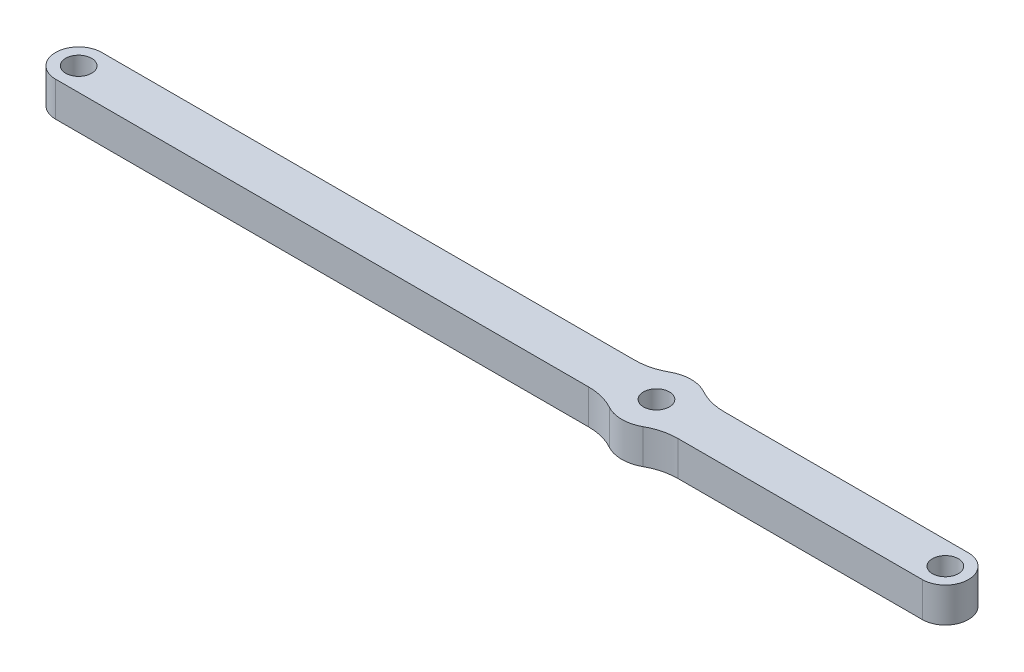
ISO-10303-21;
HEADER;
FILE_DESCRIPTION(('STEP AP214'),'2;1');
FILE_NAME('part.step','',(''),(''),'','','');
FILE_SCHEMA(('AUTOMOTIVE_DESIGN { 1 0 10303 214 1 1 1 1 }'));
ENDSEC;
DATA;
#1=APPLICATION_CONTEXT('core data for automotive mechanical design processes');
#2=APPLICATION_PROTOCOL_DEFINITION('international standard','automotive_design',2000,#1);
#3=PRODUCT_CONTEXT('',#1,'mechanical');
#4=PRODUCT('Part','Part','',(#3));
#5=PRODUCT_RELATED_PRODUCT_CATEGORY('part','',(#4));
#6=PRODUCT_DEFINITION_FORMATION('','',#4);
#7=PRODUCT_DEFINITION_CONTEXT('part definition',#1,'design');
#8=PRODUCT_DEFINITION('design','',#6,#7);
#9=PRODUCT_DEFINITION_SHAPE('','',#8);
#10=(LENGTH_UNIT() NAMED_UNIT(*) SI_UNIT(.MILLI.,.METRE.));
#11=(NAMED_UNIT(*) PLANE_ANGLE_UNIT() SI_UNIT($,.RADIAN.));
#12=(NAMED_UNIT(*) SI_UNIT($,.STERADIAN.) SOLID_ANGLE_UNIT());
#13=UNCERTAINTY_MEASURE_WITH_UNIT(LENGTH_MEASURE(1.E-05),#10,'distance_accuracy_value','');
#14=(GEOMETRIC_REPRESENTATION_CONTEXT(3) GLOBAL_UNCERTAINTY_ASSIGNED_CONTEXT((#13)) GLOBAL_UNIT_ASSIGNED_CONTEXT((#10,
#11,#12)) REPRESENTATION_CONTEXT('',''));
#15=CARTESIAN_POINT('',(0.,0.,0.));
#16=DIRECTION('',(0.,0.,1.));
#17=DIRECTION('',(1.,0.,0.));
#18=AXIS2_PLACEMENT_3D('',#15,#16,#17);
#19=CARTESIAN_POINT('',(0.,6.,0.));
#20=DIRECTION('',(0.,1.,0.));
#21=DIRECTION('',(0.,0.,1.));
#22=AXIS2_PLACEMENT_3D('',#19,#20,#21);
#23=PLANE('',#22);
#24=CARTESIAN_POINT('',(50.,6.,0.));
#25=DIRECTION('',(0.,1.,0.));
#26=DIRECTION('',(0.,0.,1.));
#27=AXIS2_PLACEMENT_3D('',#24,#25,#26);
#28=CIRCLE('',#27,2.25);
#29=CARTESIAN_POINT('',(50.,6.,2.25));
#30=VERTEX_POINT('',#29);
#31=EDGE_CURVE('E404',#30,#30,#28,.T.);
#32=ORIENTED_EDGE('',*,*,#31,.F.);
#33=EDGE_LOOP('',(#32));
#34=FACE_BOUND('',#33,.T.);
#35=DIRECTION('',(-1.,0.,0.));
#36=VECTOR('',#35,1.);
#37=CARTESIAN_POINT('',(4.47213595500337,6.,-3.99999999999576));
#38=LINE('',#37,#36);
#39=CARTESIAN_POINT('',(50.,6.,-4.00000000000001));
#40=VERTEX_POINT('',#39);
#41=CARTESIAN_POINT('',(7.74596669242288,6.,-3.99999999999606));
#42=VERTEX_POINT('',#41);
#43=EDGE_CURVE('E160',#40,#42,#38,.T.);
#44=ORIENTED_EDGE('',*,*,#43,.T.);
#45=CARTESIAN_POINT('',(7.74596669242194,6.,-13.9999999999961));
#46=DIRECTION('',(0.,1.,0.));
#47=DIRECTION('',(0.,0.,1.));
#48=AXIS2_PLACEMENT_3D('',#45,#46,#47);
#49=CIRCLE('',#48,10.);
#50=CARTESIAN_POINT('',(2.90473750965823,6.,-5.24999999999853));
#51=VERTEX_POINT('',#50);
#52=EDGE_CURVE('E207',#42,#51,#49,.F.);
#53=ORIENTED_EDGE('',*,*,#52,.T.);
#54=CARTESIAN_POINT('',(0.,6.,0.));
#55=DIRECTION('',(0.,1.,0.));
#56=DIRECTION('',(0.,0.,1.));
#57=AXIS2_PLACEMENT_3D('',#54,#55,#56);
#58=CIRCLE('',#57,6.);
#59=CARTESIAN_POINT('',(-2.90473750965556,6.,-5.25));
#60=VERTEX_POINT('',#59);
#61=EDGE_CURVE('E134',#51,#60,#58,.T.);
#62=ORIENTED_EDGE('',*,*,#61,.T.);
#63=CARTESIAN_POINT('',(-7.74596669241482,6.,-14.));
#64=DIRECTION('',(0.,1.,0.));
#65=DIRECTION('',(0.,0.,1.));
#66=AXIS2_PLACEMENT_3D('',#63,#64,#65);
#67=CIRCLE('',#66,10.);
#68=CARTESIAN_POINT('',(-7.74596669241483,6.,-4.00000000000001));
#69=VERTEX_POINT('',#68);
#70=EDGE_CURVE('E130',#60,#69,#67,.F.);
#71=ORIENTED_EDGE('',*,*,#70,.T.);
#72=DIRECTION('',(-1.,0.,0.));
#73=VECTOR('',#72,1.);
#74=CARTESIAN_POINT('',(-100.,6.,-4.00000000000001));
#75=LINE('',#74,#73);
#76=CARTESIAN_POINT('',(-100.,6.,-4.00000000000001));
#77=VERTEX_POINT('',#76);
#78=EDGE_CURVE('E121',#69,#77,#75,.T.);
#79=ORIENTED_EDGE('',*,*,#78,.T.);
#80=CARTESIAN_POINT('',(-100.,6.,0.));
#81=DIRECTION('',(0.,1.,0.));
#82=DIRECTION('',(0.,0.,1.));
#83=AXIS2_PLACEMENT_3D('',#80,#81,#82);
#84=CIRCLE('',#83,4.00000000000001);
#85=CARTESIAN_POINT('',(-100.,6.,4.00000000000001));
#86=VERTEX_POINT('',#85);
#87=EDGE_CURVE('E126',#77,#86,#84,.T.);
#88=ORIENTED_EDGE('',*,*,#87,.T.);
#89=DIRECTION('',(1.,0.,0.));
#90=VECTOR('',#89,1.);
#91=CARTESIAN_POINT('',(-4.47213595500356,6.,3.99999999999555));
#92=LINE('',#91,#90);
#93=CARTESIAN_POINT('',(-7.74596669242306,6.,3.9999999999957));
#94=VERTEX_POINT('',#93);
#95=EDGE_CURVE('E148',#86,#94,#92,.T.);
#96=ORIENTED_EDGE('',*,*,#95,.T.);
#97=CARTESIAN_POINT('',(-7.7459666924226,6.,13.9999999999957));
#98=DIRECTION('',(0.,1.,0.));
#99=DIRECTION('',(0.,0.,1.));
#100=AXIS2_PLACEMENT_3D('',#97,#98,#99);
#101=CIRCLE('',#100,10.);
#102=CARTESIAN_POINT('',(-2.90473750965847,6.,5.24999999999839));
#103=VERTEX_POINT('',#102);
#104=EDGE_CURVE('E11',#94,#103,#101,.F.);
#105=ORIENTED_EDGE('',*,*,#104,.T.);
#106=CARTESIAN_POINT('',(0.,6.,0.));
#107=DIRECTION('',(0.,1.,0.));
#108=DIRECTION('',(0.,0.,1.));
#109=AXIS2_PLACEMENT_3D('',#106,#107,#108);
#110=CIRCLE('',#109,6.);
#111=CARTESIAN_POINT('',(2.90473750965556,6.,5.25));
#112=VERTEX_POINT('',#111);
#113=EDGE_CURVE('E150',#103,#112,#110,.T.);
#114=ORIENTED_EDGE('',*,*,#113,.T.);
#115=CARTESIAN_POINT('',(7.74596669241482,6.,14.));
#116=DIRECTION('',(0.,1.,0.));
#117=DIRECTION('',(0.,0.,1.));
#118=AXIS2_PLACEMENT_3D('',#115,#116,#117);
#119=CIRCLE('',#118,10.);
#120=CARTESIAN_POINT('',(7.74596669241483,6.,4.00000000000001));
#121=VERTEX_POINT('',#120);
#122=EDGE_CURVE('E214',#112,#121,#119,.F.);
#123=ORIENTED_EDGE('',*,*,#122,.T.);
#124=DIRECTION('',(1.,0.,0.));
#125=VECTOR('',#124,1.);
#126=CARTESIAN_POINT('',(50.,6.,4.00000000000001));
#127=LINE('',#126,#125);
#128=CARTESIAN_POINT('',(50.,6.,4.00000000000001));
#129=VERTEX_POINT('',#128);
#130=EDGE_CURVE('E156',#121,#129,#127,.T.);
#131=ORIENTED_EDGE('',*,*,#130,.T.);
#132=CARTESIAN_POINT('',(50.,6.,0.));
#133=DIRECTION('',(0.,1.,0.));
#134=DIRECTION('',(0.,0.,1.));
#135=AXIS2_PLACEMENT_3D('',#132,#133,#134);
#136=CIRCLE('',#135,4.00000000000001);
#137=EDGE_CURVE('E158',#129,#40,#136,.T.);
#138=ORIENTED_EDGE('',*,*,#137,.T.);
#139=EDGE_LOOP('',(#44,#53,#62,#71,#79,#88,#96,#105,#114,#123,#131,#138));
#140=FACE_BOUND('',#139,.T.);
#141=CARTESIAN_POINT('',(0.,6.,0.));
#142=DIRECTION('',(0.,1.,0.));
#143=DIRECTION('',(0.,0.,1.));
#144=AXIS2_PLACEMENT_3D('',#141,#142,#143);
#145=CIRCLE('',#144,2.25);
#146=CARTESIAN_POINT('',(0.,6.,2.25));
#147=VERTEX_POINT('',#146);
#148=EDGE_CURVE('E166',#147,#147,#145,.T.);
#149=ORIENTED_EDGE('',*,*,#148,.F.);
#150=EDGE_LOOP('',(#149));
#151=FACE_BOUND('',#150,.T.);
#152=CARTESIAN_POINT('',(-100.,6.,0.));
#153=DIRECTION('',(0.,1.,0.));
#154=DIRECTION('',(0.,0.,1.));
#155=AXIS2_PLACEMENT_3D('',#152,#153,#154);
#156=CIRCLE('',#155,2.25);
#157=CARTESIAN_POINT('',(-100.,6.,2.25));
#158=VERTEX_POINT('',#157);
#159=EDGE_CURVE('E395',#158,#158,#156,.T.);
#160=ORIENTED_EDGE('',*,*,#159,.F.);
#161=EDGE_LOOP('',(#160));
#162=FACE_BOUND('',#161,.T.);
#163=ADVANCED_FACE('F33',(#34,#140,#151,#162),#23,.T.);
#164=CARTESIAN_POINT('',(0.,0.,0.));
#165=DIRECTION('',(0.,1.,0.));
#166=DIRECTION('',(0.,0.,1.));
#167=AXIS2_PLACEMENT_3D('',#164,#165,#166);
#168=PLANE('',#167);
#169=CARTESIAN_POINT('',(0.,0.,0.));
#170=DIRECTION('',(0.,1.,0.));
#171=DIRECTION('',(0.,0.,1.));
#172=AXIS2_PLACEMENT_3D('',#169,#170,#171);
#173=CIRCLE('',#172,6.);
#174=CARTESIAN_POINT('',(2.90473750965823,0.,-5.24999999999853));
#175=VERTEX_POINT('',#174);
#176=CARTESIAN_POINT('',(-2.90473750965556,0.,-5.25));
#177=VERTEX_POINT('',#176);
#178=EDGE_CURVE('E163',#175,#177,#173,.T.);
#179=ORIENTED_EDGE('',*,*,#178,.F.);
#180=CARTESIAN_POINT('',(7.74596669242194,0.,-13.9999999999961));
#181=DIRECTION('',(0.,1.,0.));
#182=DIRECTION('',(0.,0.,1.));
#183=AXIS2_PLACEMENT_3D('',#180,#181,#182);
#184=CIRCLE('',#183,10.);
#185=CARTESIAN_POINT('',(7.74596669242288,0.,-3.99999999999606));
#186=VERTEX_POINT('',#185);
#187=EDGE_CURVE('E205',#175,#186,#184,.T.);
#188=ORIENTED_EDGE('',*,*,#187,.T.);
#189=DIRECTION('',(-1.,0.,0.));
#190=VECTOR('',#189,1.);
#191=CARTESIAN_POINT('',(4.47213595500337,0.,-3.99999999999576));
#192=LINE('',#191,#190);
#193=CARTESIAN_POINT('',(50.,0.,-4.00000000000001));
#194=VERTEX_POINT('',#193);
#195=EDGE_CURVE('E179',#194,#186,#192,.T.);
#196=ORIENTED_EDGE('',*,*,#195,.F.);
#197=CARTESIAN_POINT('',(50.,0.,0.));
#198=DIRECTION('',(0.,1.,0.));
#199=DIRECTION('',(0.,0.,1.));
#200=AXIS2_PLACEMENT_3D('',#197,#198,#199);
#201=CIRCLE('',#200,4.00000000000001);
#202=CARTESIAN_POINT('',(50.,0.,4.00000000000001));
#203=VERTEX_POINT('',#202);
#204=EDGE_CURVE('E177',#203,#194,#201,.T.);
#205=ORIENTED_EDGE('',*,*,#204,.F.);
#206=DIRECTION('',(1.,0.,0.));
#207=VECTOR('',#206,1.);
#208=CARTESIAN_POINT('',(50.,0.,4.00000000000001));
#209=LINE('',#208,#207);
#210=CARTESIAN_POINT('',(7.74596669241483,0.,4.00000000000001));
#211=VERTEX_POINT('',#210);
#212=EDGE_CURVE('E175',#211,#203,#209,.T.);
#213=ORIENTED_EDGE('',*,*,#212,.F.);
#214=CARTESIAN_POINT('',(7.74596669241482,0.,14.));
#215=DIRECTION('',(0.,1.,0.));
#216=DIRECTION('',(0.,0.,1.));
#217=AXIS2_PLACEMENT_3D('',#214,#215,#216);
#218=CIRCLE('',#217,10.);
#219=CARTESIAN_POINT('',(2.90473750965556,0.,5.25));
#220=VERTEX_POINT('',#219);
#221=EDGE_CURVE('E212',#211,#220,#218,.T.);
#222=ORIENTED_EDGE('',*,*,#221,.T.);
#223=CARTESIAN_POINT('',(0.,0.,0.));
#224=DIRECTION('',(0.,1.,0.));
#225=DIRECTION('',(0.,0.,1.));
#226=AXIS2_PLACEMENT_3D('',#223,#224,#225);
#227=CIRCLE('',#226,6.);
#228=CARTESIAN_POINT('',(-2.90473750965847,0.,5.24999999999839));
#229=VERTEX_POINT('',#228);
#230=EDGE_CURVE('E172',#229,#220,#227,.T.);
#231=ORIENTED_EDGE('',*,*,#230,.F.);
#232=CARTESIAN_POINT('',(-7.7459666924226,0.,13.9999999999957));
#233=DIRECTION('',(0.,1.,0.));
#234=DIRECTION('',(0.,0.,1.));
#235=AXIS2_PLACEMENT_3D('',#232,#233,#234);
#236=CIRCLE('',#235,10.);
#237=CARTESIAN_POINT('',(-7.74596669242306,0.,3.9999999999957));
#238=VERTEX_POINT('',#237);
#239=EDGE_CURVE('E41',#229,#238,#236,.T.);
#240=ORIENTED_EDGE('',*,*,#239,.T.);
#241=DIRECTION('',(1.,0.,0.));
#242=VECTOR('',#241,1.);
#243=CARTESIAN_POINT('',(-4.47213595500356,0.,3.99999999999555));
#244=LINE('',#243,#242);
#245=CARTESIAN_POINT('',(-100.,0.,4.00000000000001));
#246=VERTEX_POINT('',#245);
#247=EDGE_CURVE('E170',#246,#238,#244,.T.);
#248=ORIENTED_EDGE('',*,*,#247,.F.);
#249=CARTESIAN_POINT('',(-100.,0.,0.));
#250=DIRECTION('',(0.,1.,0.));
#251=DIRECTION('',(0.,0.,1.));
#252=AXIS2_PLACEMENT_3D('',#249,#250,#251);
#253=CIRCLE('',#252,4.00000000000001);
#254=CARTESIAN_POINT('',(-100.,0.,-4.00000000000001));
#255=VERTEX_POINT('',#254);
#256=EDGE_CURVE('E168',#255,#246,#253,.T.);
#257=ORIENTED_EDGE('',*,*,#256,.F.);
#258=DIRECTION('',(-1.,0.,0.));
#259=VECTOR('',#258,1.);
#260=CARTESIAN_POINT('',(-100.,0.,-4.00000000000001));
#261=LINE('',#260,#259);
#262=CARTESIAN_POINT('',(-7.74596669241483,0.,-4.00000000000001));
#263=VERTEX_POINT('',#262);
#264=EDGE_CURVE('E140',#263,#255,#261,.T.);
#265=ORIENTED_EDGE('',*,*,#264,.F.);
#266=CARTESIAN_POINT('',(-7.74596669241482,0.,-14.));
#267=DIRECTION('',(0.,1.,0.));
#268=DIRECTION('',(0.,0.,1.));
#269=AXIS2_PLACEMENT_3D('',#266,#267,#268);
#270=CIRCLE('',#269,10.);
#271=EDGE_CURVE('E209',#263,#177,#270,.T.);
#272=ORIENTED_EDGE('',*,*,#271,.T.);
#273=EDGE_LOOP('',(#179,#188,#196,#205,#213,#222,#231,#240,#248,#257,#265,#272));
#274=FACE_BOUND('',#273,.T.);
#275=CARTESIAN_POINT('',(0.,0.,0.));
#276=DIRECTION('',(0.,1.,0.));
#277=DIRECTION('',(0.,0.,1.));
#278=AXIS2_PLACEMENT_3D('',#275,#276,#277);
#279=CIRCLE('',#278,2.25);
#280=CARTESIAN_POINT('',(0.,0.,2.25));
#281=VERTEX_POINT('',#280);
#282=EDGE_CURVE('E407',#281,#281,#279,.T.);
#283=ORIENTED_EDGE('',*,*,#282,.T.);
#284=EDGE_LOOP('',(#283));
#285=FACE_BOUND('',#284,.T.);
#286=CARTESIAN_POINT('',(50.,0.,0.));
#287=DIRECTION('',(0.,1.,0.));
#288=DIRECTION('',(0.,0.,1.));
#289=AXIS2_PLACEMENT_3D('',#286,#287,#288);
#290=CIRCLE('',#289,2.25);
#291=CARTESIAN_POINT('',(50.,0.,2.25));
#292=VERTEX_POINT('',#291);
#293=EDGE_CURVE('E401',#292,#292,#290,.T.);
#294=ORIENTED_EDGE('',*,*,#293,.T.);
#295=EDGE_LOOP('',(#294));
#296=FACE_BOUND('',#295,.T.);
#297=CARTESIAN_POINT('',(-100.,0.,0.));
#298=DIRECTION('',(0.,1.,0.));
#299=DIRECTION('',(0.,0.,1.));
#300=AXIS2_PLACEMENT_3D('',#297,#298,#299);
#301=CIRCLE('',#300,2.25);
#302=CARTESIAN_POINT('',(-100.,0.,2.25));
#303=VERTEX_POINT('',#302);
#304=EDGE_CURVE('E398',#303,#303,#301,.T.);
#305=ORIENTED_EDGE('',*,*,#304,.T.);
#306=EDGE_LOOP('',(#305));
#307=FACE_BOUND('',#306,.T.);
#308=ADVANCED_FACE('F228',(#274,#285,#296,#307),#168,.F.);
#309=CARTESIAN_POINT('',(0.,6.,0.));
#310=DIRECTION('',(0.,-1.,0.));
#311=DIRECTION('',(0.,0.,-1.));
#312=AXIS2_PLACEMENT_3D('',#309,#310,#311);
#313=CYLINDRICAL_SURFACE('',#312,6.);
#314=ORIENTED_EDGE('',*,*,#61,.F.);
#315=DIRECTION('',(0.,-1.,0.));
#316=VECTOR('',#315,1.);
#317=CARTESIAN_POINT('',(2.90473750965823,6.,-5.24999999999853));
#318=LINE('',#317,#316);
#319=EDGE_CURVE('E189',#51,#175,#318,.T.);
#320=ORIENTED_EDGE('',*,*,#319,.T.);
#321=ORIENTED_EDGE('',*,*,#178,.T.);
#322=DIRECTION('',(0.,-1.,0.));
#323=VECTOR('',#322,1.);
#324=CARTESIAN_POINT('',(-2.90473750965556,6.,-5.25));
#325=LINE('',#324,#323);
#326=EDGE_CURVE('E143',#177,#60,#325,.F.);
#327=ORIENTED_EDGE('',*,*,#326,.T.);
#328=EDGE_LOOP('',(#314,#320,#321,#327));
#329=FACE_BOUND('',#328,.T.);
#330=ADVANCED_FACE('F241',(#329),#313,.T.);
#331=CARTESIAN_POINT('',(-100.,6.,-4.00000000000001));
#332=DIRECTION('',(0.,0.,1.));
#333=DIRECTION('',(1.,0.,0.));
#334=AXIS2_PLACEMENT_3D('',#331,#332,#333);
#335=PLANE('',#334);
#336=ORIENTED_EDGE('',*,*,#78,.F.);
#337=DIRECTION('',(0.,1.,0.));
#338=VECTOR('',#337,1.);
#339=CARTESIAN_POINT('',(-7.74596669241482,0.,-4.00000000000001));
#340=LINE('',#339,#338);
#341=EDGE_CURVE('E194',#69,#263,#340,.F.);
#342=ORIENTED_EDGE('',*,*,#341,.T.);
#343=ORIENTED_EDGE('',*,*,#264,.T.);
#344=DIRECTION('',(0.,-1.,0.));
#345=VECTOR('',#344,1.);
#346=CARTESIAN_POINT('',(-100.,6.,-4.00000000000001));
#347=LINE('',#346,#345);
#348=EDGE_CURVE('E137',#77,#255,#347,.T.);
#349=ORIENTED_EDGE('',*,*,#348,.F.);
#350=EDGE_LOOP('',(#336,#342,#343,#349));
#351=FACE_BOUND('',#350,.T.);
#352=ADVANCED_FACE('F138',(#351),#335,.F.);
#353=CARTESIAN_POINT('',(-100.,6.,0.));
#354=DIRECTION('',(0.,-1.,0.));
#355=DIRECTION('',(0.,0.,-1.));
#356=AXIS2_PLACEMENT_3D('',#353,#354,#355);
#357=CYLINDRICAL_SURFACE('',#356,4.00000000000001);
#358=ORIENTED_EDGE('',*,*,#256,.T.);
#359=DIRECTION('',(0.,-1.,0.));
#360=VECTOR('',#359,1.);
#361=CARTESIAN_POINT('',(-100.,6.,4.00000000000001));
#362=LINE('',#361,#360);
#363=EDGE_CURVE('E144',#86,#246,#362,.T.);
#364=ORIENTED_EDGE('',*,*,#363,.F.);
#365=ORIENTED_EDGE('',*,*,#87,.F.);
#366=ORIENTED_EDGE('',*,*,#348,.T.);
#367=EDGE_LOOP('',(#358,#364,#365,#366));
#368=FACE_BOUND('',#367,.T.);
#369=ADVANCED_FACE('F146',(#368),#357,.T.);
#370=CARTESIAN_POINT('',(-4.47213595500356,6.,3.99999999999555));
#371=DIRECTION('',(0.,0.,-1.));
#372=DIRECTION('',(-1.,0.,0.));
#373=AXIS2_PLACEMENT_3D('',#370,#371,#372);
#374=PLANE('',#373);
#375=ORIENTED_EDGE('',*,*,#247,.T.);
#376=DIRECTION('',(0.,1.,0.));
#377=VECTOR('',#376,1.);
#378=CARTESIAN_POINT('',(-7.74596669242306,6.,3.9999999999957));
#379=LINE('',#378,#377);
#380=EDGE_CURVE('E48',#238,#94,#379,.T.);
#381=ORIENTED_EDGE('',*,*,#380,.T.);
#382=ORIENTED_EDGE('',*,*,#95,.F.);
#383=ORIENTED_EDGE('',*,*,#363,.T.);
#384=EDGE_LOOP('',(#375,#381,#382,#383));
#385=FACE_BOUND('',#384,.T.);
#386=ADVANCED_FACE('F236',(#385),#374,.F.);
#387=CARTESIAN_POINT('',(0.,6.,0.));
#388=DIRECTION('',(0.,-1.,0.));
#389=DIRECTION('',(0.,0.,-1.));
#390=AXIS2_PLACEMENT_3D('',#387,#388,#389);
#391=CYLINDRICAL_SURFACE('',#390,6.);
#392=ORIENTED_EDGE('',*,*,#230,.T.);
#393=DIRECTION('',(0.,-1.,0.));
#394=VECTOR('',#393,1.);
#395=CARTESIAN_POINT('',(2.90473750965556,6.,5.25));
#396=LINE('',#395,#394);
#397=EDGE_CURVE('E202',#220,#112,#396,.F.);
#398=ORIENTED_EDGE('',*,*,#397,.T.);
#399=ORIENTED_EDGE('',*,*,#113,.F.);
#400=DIRECTION('',(0.,-1.,0.));
#401=VECTOR('',#400,1.);
#402=CARTESIAN_POINT('',(-2.90473750965847,6.,5.24999999999839));
#403=LINE('',#402,#401);
#404=EDGE_CURVE('E199',#103,#229,#403,.T.);
#405=ORIENTED_EDGE('',*,*,#404,.T.);
#406=EDGE_LOOP('',(#392,#398,#399,#405));
#407=FACE_BOUND('',#406,.T.);
#408=ADVANCED_FACE('F232',(#407),#391,.T.);
#409=CARTESIAN_POINT('',(50.,6.,4.00000000000001));
#410=DIRECTION('',(0.,0.,-1.));
#411=DIRECTION('',(-1.,0.,0.));
#412=AXIS2_PLACEMENT_3D('',#409,#410,#411);
#413=PLANE('',#412);
#414=ORIENTED_EDGE('',*,*,#130,.F.);
#415=DIRECTION('',(0.,1.,0.));
#416=VECTOR('',#415,1.);
#417=CARTESIAN_POINT('',(7.74596669241482,0.,4.00000000000001));
#418=LINE('',#417,#416);
#419=EDGE_CURVE('E196',#121,#211,#418,.F.);
#420=ORIENTED_EDGE('',*,*,#419,.T.);
#421=ORIENTED_EDGE('',*,*,#212,.T.);
#422=DIRECTION('',(0.,-1.,0.));
#423=VECTOR('',#422,1.);
#424=CARTESIAN_POINT('',(50.,6.,4.00000000000001));
#425=LINE('',#424,#423);
#426=EDGE_CURVE('E184',#129,#203,#425,.T.);
#427=ORIENTED_EDGE('',*,*,#426,.F.);
#428=EDGE_LOOP('',(#414,#420,#421,#427));
#429=FACE_BOUND('',#428,.T.);
#430=ADVANCED_FACE('F223',(#429),#413,.F.);
#431=CARTESIAN_POINT('',(50.,6.,0.));
#432=DIRECTION('',(0.,-1.,0.));
#433=DIRECTION('',(0.,0.,-1.));
#434=AXIS2_PLACEMENT_3D('',#431,#432,#433);
#435=CYLINDRICAL_SURFACE('',#434,4.00000000000001);
#436=ORIENTED_EDGE('',*,*,#204,.T.);
#437=DIRECTION('',(0.,-1.,0.));
#438=VECTOR('',#437,1.);
#439=CARTESIAN_POINT('',(50.,6.,-4.00000000000001));
#440=LINE('',#439,#438);
#441=EDGE_CURVE('E162',#40,#194,#440,.T.);
#442=ORIENTED_EDGE('',*,*,#441,.F.);
#443=ORIENTED_EDGE('',*,*,#137,.F.);
#444=ORIENTED_EDGE('',*,*,#426,.T.);
#445=EDGE_LOOP('',(#436,#442,#443,#444));
#446=FACE_BOUND('',#445,.T.);
#447=ADVANCED_FACE('F269',(#446),#435,.T.);
#448=CARTESIAN_POINT('',(4.47213595500337,6.,-3.99999999999576));
#449=DIRECTION('',(0.,0.,1.));
#450=DIRECTION('',(1.,0.,0.));
#451=AXIS2_PLACEMENT_3D('',#448,#449,#450);
#452=PLANE('',#451);
#453=ORIENTED_EDGE('',*,*,#195,.T.);
#454=DIRECTION('',(0.,1.,0.));
#455=VECTOR('',#454,1.);
#456=CARTESIAN_POINT('',(7.74596669242288,6.,-3.99999999999607));
#457=LINE('',#456,#455);
#458=EDGE_CURVE('E192',#186,#42,#457,.T.);
#459=ORIENTED_EDGE('',*,*,#458,.T.);
#460=ORIENTED_EDGE('',*,*,#43,.F.);
#461=ORIENTED_EDGE('',*,*,#441,.T.);
#462=EDGE_LOOP('',(#453,#459,#460,#461));
#463=FACE_BOUND('',#462,.T.);
#464=ADVANCED_FACE('F266',(#463),#452,.F.);
#465=CARTESIAN_POINT('',(0.,6.,0.));
#466=DIRECTION('',(0.,-1.,0.));
#467=DIRECTION('',(0.,0.,-1.));
#468=AXIS2_PLACEMENT_3D('',#465,#466,#467);
#469=CYLINDRICAL_SURFACE('',#468,2.25);
#470=ORIENTED_EDGE('',*,*,#148,.T.);
#471=EDGE_LOOP('',(#470));
#472=FACE_BOUND('',#471,.T.);
#473=ORIENTED_EDGE('',*,*,#282,.F.);
#474=EDGE_LOOP('',(#473));
#475=FACE_BOUND('',#474,.T.);
#476=ADVANCED_FACE('F263',(#472,#475),#469,.F.);
#477=CARTESIAN_POINT('',(50.,6.,0.));
#478=DIRECTION('',(0.,-1.,0.));
#479=DIRECTION('',(0.,0.,-1.));
#480=AXIS2_PLACEMENT_3D('',#477,#478,#479);
#481=CYLINDRICAL_SURFACE('',#480,2.25);
#482=ORIENTED_EDGE('',*,*,#31,.T.);
#483=EDGE_LOOP('',(#482));
#484=FACE_BOUND('',#483,.T.);
#485=ORIENTED_EDGE('',*,*,#293,.F.);
#486=EDGE_LOOP('',(#485));
#487=FACE_BOUND('',#486,.T.);
#488=ADVANCED_FACE('F324',(#484,#487),#481,.F.);
#489=CARTESIAN_POINT('',(-100.,6.,0.));
#490=DIRECTION('',(0.,-1.,0.));
#491=DIRECTION('',(0.,0.,-1.));
#492=AXIS2_PLACEMENT_3D('',#489,#490,#491);
#493=CYLINDRICAL_SURFACE('',#492,2.25);
#494=ORIENTED_EDGE('',*,*,#159,.T.);
#495=EDGE_LOOP('',(#494));
#496=FACE_BOUND('',#495,.T.);
#497=ORIENTED_EDGE('',*,*,#304,.F.);
#498=EDGE_LOOP('',(#497));
#499=FACE_BOUND('',#498,.T.);
#500=ADVANCED_FACE('F251',(#496,#499),#493,.F.);
#501=CARTESIAN_POINT('',(7.74596669242194,6.,-13.9999999999961));
#502=DIRECTION('',(0.,-1.,0.));
#503=DIRECTION('',(0.,0.,-1.));
#504=AXIS2_PLACEMENT_3D('',#501,#502,#503);
#505=CYLINDRICAL_SURFACE('',#504,10.);
#506=ORIENTED_EDGE('',*,*,#52,.F.);
#507=ORIENTED_EDGE('',*,*,#458,.F.);
#508=ORIENTED_EDGE('',*,*,#187,.F.);
#509=ORIENTED_EDGE('',*,*,#319,.F.);
#510=EDGE_LOOP('',(#506,#507,#508,#509));
#511=FACE_BOUND('',#510,.T.);
#512=ADVANCED_FACE('F245',(#511),#505,.F.);
#513=CARTESIAN_POINT('',(-7.74596669241482,6.,-14.));
#514=DIRECTION('',(0.,-1.,0.));
#515=DIRECTION('',(0.,0.,-1.));
#516=AXIS2_PLACEMENT_3D('',#513,#514,#515);
#517=CYLINDRICAL_SURFACE('',#516,10.);
#518=ORIENTED_EDGE('',*,*,#70,.F.);
#519=ORIENTED_EDGE('',*,*,#326,.F.);
#520=ORIENTED_EDGE('',*,*,#271,.F.);
#521=ORIENTED_EDGE('',*,*,#341,.F.);
#522=EDGE_LOOP('',(#518,#519,#520,#521));
#523=FACE_BOUND('',#522,.T.);
#524=ADVANCED_FACE('F243',(#523),#517,.F.);
#525=CARTESIAN_POINT('',(7.74596669241482,6.,14.));
#526=DIRECTION('',(0.,-1.,0.));
#527=DIRECTION('',(0.,0.,-1.));
#528=AXIS2_PLACEMENT_3D('',#525,#526,#527);
#529=CYLINDRICAL_SURFACE('',#528,10.);
#530=ORIENTED_EDGE('',*,*,#122,.F.);
#531=ORIENTED_EDGE('',*,*,#397,.F.);
#532=ORIENTED_EDGE('',*,*,#221,.F.);
#533=ORIENTED_EDGE('',*,*,#419,.F.);
#534=EDGE_LOOP('',(#530,#531,#532,#533));
#535=FACE_BOUND('',#534,.T.);
#536=ADVANCED_FACE('F226',(#535),#529,.F.);
#537=CARTESIAN_POINT('',(-7.7459666924226,6.,13.9999999999957));
#538=DIRECTION('',(0.,-1.,0.));
#539=DIRECTION('',(0.,0.,-1.));
#540=AXIS2_PLACEMENT_3D('',#537,#538,#539);
#541=CYLINDRICAL_SURFACE('',#540,10.);
#542=ORIENTED_EDGE('',*,*,#104,.F.);
#543=ORIENTED_EDGE('',*,*,#380,.F.);
#544=ORIENTED_EDGE('',*,*,#239,.F.);
#545=ORIENTED_EDGE('',*,*,#404,.F.);
#546=EDGE_LOOP('',(#542,#543,#544,#545));
#547=FACE_BOUND('',#546,.T.);
#548=ADVANCED_FACE('F35',(#547),#541,.F.);
#549=CLOSED_SHELL('',(#163,#308,#330,#352,#369,#386,#408,#430,#447,#464,#476,#488,#500,#512,
#524,#536,#548));
#550=MANIFOLD_SOLID_BREP('B2',#549);
#551=ADVANCED_BREP_SHAPE_REPRESENTATION('',(#18,#550),#14);
#552=SHAPE_DEFINITION_REPRESENTATION(#9,#551);
ENDSEC;
END-ISO-10303-21;
